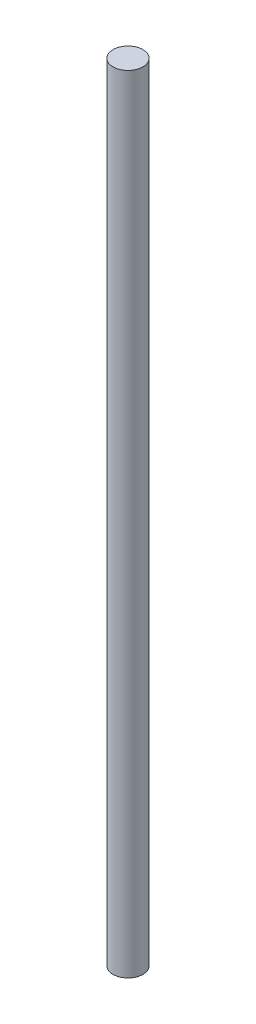
ISO-10303-21;
HEADER;
FILE_DESCRIPTION(('STEP AP214'),'2;1');
FILE_NAME('part.step','',(''),(''),'','','');
FILE_SCHEMA(('AUTOMOTIVE_DESIGN { 1 0 10303 214 1 1 1 1 }'));
ENDSEC;
DATA;
#1=APPLICATION_CONTEXT('core data for automotive mechanical design processes');
#2=APPLICATION_PROTOCOL_DEFINITION('international standard','automotive_design',2000,#1);
#3=PRODUCT_CONTEXT('',#1,'mechanical');
#4=PRODUCT('Part','Part','',(#3));
#5=PRODUCT_RELATED_PRODUCT_CATEGORY('part','',(#4));
#6=PRODUCT_DEFINITION_FORMATION('','',#4);
#7=PRODUCT_DEFINITION_CONTEXT('part definition',#1,'design');
#8=PRODUCT_DEFINITION('design','',#6,#7);
#9=PRODUCT_DEFINITION_SHAPE('','',#8);
#10=(LENGTH_UNIT() NAMED_UNIT(*) SI_UNIT(.MILLI.,.METRE.));
#11=(NAMED_UNIT(*) PLANE_ANGLE_UNIT() SI_UNIT($,.RADIAN.));
#12=(NAMED_UNIT(*) SI_UNIT($,.STERADIAN.) SOLID_ANGLE_UNIT());
#13=UNCERTAINTY_MEASURE_WITH_UNIT(LENGTH_MEASURE(1.E-05),#10,'distance_accuracy_value','');
#14=(GEOMETRIC_REPRESENTATION_CONTEXT(3) GLOBAL_UNCERTAINTY_ASSIGNED_CONTEXT((#13)) GLOBAL_UNIT_ASSIGNED_CONTEXT((#10,
#11,#12)) REPRESENTATION_CONTEXT('',''));
#15=CARTESIAN_POINT('',(0.,0.,0.));
#16=DIRECTION('',(0.,0.,1.));
#17=DIRECTION('',(1.,0.,0.));
#18=AXIS2_PLACEMENT_3D('',#15,#16,#17);
#19=CARTESIAN_POINT('',(0.,105.,0.));
#20=DIRECTION('',(0.,-1.,0.));
#21=DIRECTION('',(0.,0.,-1.));
#22=AXIS2_PLACEMENT_3D('',#19,#20,#21);
#23=CYLINDRICAL_SURFACE('',#22,4.);
#24=CARTESIAN_POINT('',(0.,105.,0.));
#25=DIRECTION('',(0.,1.,0.));
#26=DIRECTION('',(0.,0.,1.));
#27=AXIS2_PLACEMENT_3D('',#24,#25,#26);
#28=CIRCLE('',#27,4.);
#29=CARTESIAN_POINT('',(0.,105.,4.));
#30=VERTEX_POINT('',#29);
#31=EDGE_CURVE('E10',#30,#30,#28,.T.);
#32=ORIENTED_EDGE('',*,*,#31,.F.);
#33=EDGE_LOOP('',(#32));
#34=FACE_BOUND('',#33,.T.);
#35=CARTESIAN_POINT('',(0.,-105.,0.));
#36=DIRECTION('',(0.,1.,0.));
#37=DIRECTION('',(0.,0.,1.));
#38=AXIS2_PLACEMENT_3D('',#35,#36,#37);
#39=CIRCLE('',#38,4.);
#40=CARTESIAN_POINT('',(0.,-105.,4.));
#41=VERTEX_POINT('',#40);
#42=EDGE_CURVE('E42',#41,#41,#39,.T.);
#43=ORIENTED_EDGE('',*,*,#42,.T.);
#44=EDGE_LOOP('',(#43));
#45=FACE_BOUND('',#44,.T.);
#46=ADVANCED_FACE('F39',(#34,#45),#23,.T.);
#47=CARTESIAN_POINT('',(0.,105.,0.));
#48=DIRECTION('',(0.,1.,0.));
#49=DIRECTION('',(0.,0.,1.));
#50=AXIS2_PLACEMENT_3D('',#47,#48,#49);
#51=PLANE('',#50);
#52=ORIENTED_EDGE('',*,*,#31,.T.);
#53=EDGE_LOOP('',(#52));
#54=FACE_BOUND('',#53,.T.);
#55=ADVANCED_FACE('F54',(#54),#51,.T.);
#56=CARTESIAN_POINT('',(0.,-105.,0.));
#57=DIRECTION('',(0.,1.,0.));
#58=DIRECTION('',(0.,0.,1.));
#59=AXIS2_PLACEMENT_3D('',#56,#57,#58);
#60=PLANE('',#59);
#61=ORIENTED_EDGE('',*,*,#42,.F.);
#62=EDGE_LOOP('',(#61));
#63=FACE_BOUND('',#62,.T.);
#64=ADVANCED_FACE('F52',(#63),#60,.F.);
#65=CLOSED_SHELL('',(#46,#55,#64));
#66=MANIFOLD_SOLID_BREP('B2',#65);
#67=ADVANCED_BREP_SHAPE_REPRESENTATION('',(#18,#66),#14);
#68=SHAPE_DEFINITION_REPRESENTATION(#9,#67);
ENDSEC;
END-ISO-10303-21;
